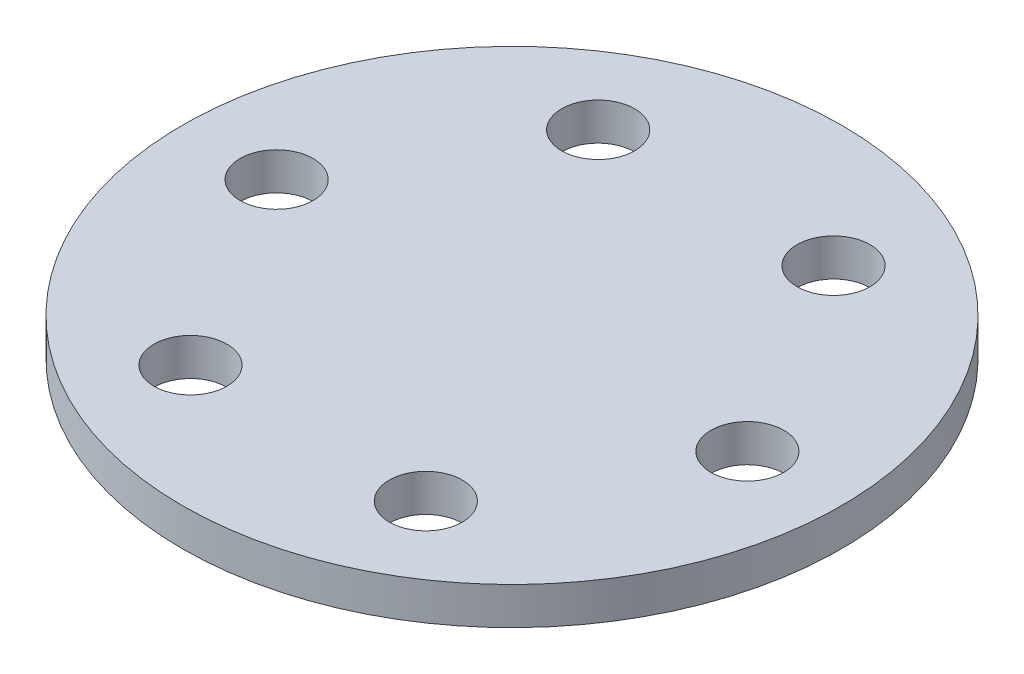
ISO-10303-21;
HEADER;
FILE_DESCRIPTION(('STEP AP214'),'2;1');
FILE_NAME('part.step','',(''),(''),'','','');
FILE_SCHEMA(('AUTOMOTIVE_DESIGN { 1 0 10303 214 1 1 1 1 }'));
ENDSEC;
DATA;
#1=APPLICATION_CONTEXT('core data for automotive mechanical design processes');
#2=APPLICATION_PROTOCOL_DEFINITION('international standard','automotive_design',2000,#1);
#3=PRODUCT_CONTEXT('',#1,'mechanical');
#4=PRODUCT('Part','Part','',(#3));
#5=PRODUCT_RELATED_PRODUCT_CATEGORY('part','',(#4));
#6=PRODUCT_DEFINITION_FORMATION('','',#4);
#7=PRODUCT_DEFINITION_CONTEXT('part definition',#1,'design');
#8=PRODUCT_DEFINITION('design','',#6,#7);
#9=PRODUCT_DEFINITION_SHAPE('','',#8);
#10=(LENGTH_UNIT() NAMED_UNIT(*) SI_UNIT(.MILLI.,.METRE.));
#11=(NAMED_UNIT(*) PLANE_ANGLE_UNIT() SI_UNIT($,.RADIAN.));
#12=(NAMED_UNIT(*) SI_UNIT($,.STERADIAN.) SOLID_ANGLE_UNIT());
#13=UNCERTAINTY_MEASURE_WITH_UNIT(LENGTH_MEASURE(1.E-05),#10,'distance_accuracy_value','');
#14=(GEOMETRIC_REPRESENTATION_CONTEXT(3) GLOBAL_UNCERTAINTY_ASSIGNED_CONTEXT((#13)) GLOBAL_UNIT_ASSIGNED_CONTEXT((#10,
#11,#12)) REPRESENTATION_CONTEXT('',''));
#15=CARTESIAN_POINT('',(0.,0.,0.));
#16=DIRECTION('',(0.,0.,1.));
#17=DIRECTION('',(1.,0.,0.));
#18=AXIS2_PLACEMENT_3D('',#15,#16,#17);
#19=CARTESIAN_POINT('',(0.,1.5875,0.));
#20=DIRECTION('',(0.,-1.,0.));
#21=DIRECTION('',(0.,0.,-1.));
#22=AXIS2_PLACEMENT_3D('',#19,#20,#21);
#23=CYLINDRICAL_SURFACE('',#22,14.);
#24=CARTESIAN_POINT('',(0.,1.5875,0.));
#25=DIRECTION('',(0.,1.,0.));
#26=DIRECTION('',(0.,0.,1.));
#27=AXIS2_PLACEMENT_3D('',#24,#25,#26);
#28=CIRCLE('',#27,14.);
#29=CARTESIAN_POINT('',(0.,1.5875,14.));
#30=VERTEX_POINT('',#29);
#31=EDGE_CURVE('E10',#30,#30,#28,.T.);
#32=ORIENTED_EDGE('',*,*,#31,.F.);
#33=EDGE_LOOP('',(#32));
#34=FACE_BOUND('',#33,.T.);
#35=CARTESIAN_POINT('',(0.,0.,0.));
#36=DIRECTION('',(0.,1.,0.));
#37=DIRECTION('',(0.,0.,1.));
#38=AXIS2_PLACEMENT_3D('',#35,#36,#37);
#39=CIRCLE('',#38,14.);
#40=CARTESIAN_POINT('',(0.,0.,14.));
#41=VERTEX_POINT('',#40);
#42=EDGE_CURVE('E39',#41,#41,#39,.T.);
#43=ORIENTED_EDGE('',*,*,#42,.T.);
#44=EDGE_LOOP('',(#43));
#45=FACE_BOUND('',#44,.T.);
#46=ADVANCED_FACE('F36',(#34,#45),#23,.T.);
#47=CARTESIAN_POINT('',(0.,1.5875,0.));
#48=DIRECTION('',(0.,1.,0.));
#49=DIRECTION('',(0.,0.,1.));
#50=AXIS2_PLACEMENT_3D('',#47,#48,#49);
#51=PLANE('',#50);
#52=CARTESIAN_POINT('',(-5.0000000000001,1.5875,8.66025403784433));
#53=DIRECTION('',(0.,1.,0.));
#54=DIRECTION('',(0.,0.,1.));
#55=AXIS2_PLACEMENT_3D('',#52,#53,#54);
#56=CIRCLE('',#55,1.54999999999999);
#57=CARTESIAN_POINT('',(-5.0000000000001,1.5875,10.2102540378443));
#58=VERTEX_POINT('',#57);
#59=EDGE_CURVE('E80',#58,#58,#56,.T.);
#60=ORIENTED_EDGE('',*,*,#59,.F.);
#61=EDGE_LOOP('',(#60));
#62=FACE_BOUND('',#61,.T.);
#63=CARTESIAN_POINT('',(-10.,1.5875,0.));
#64=DIRECTION('',(0.,1.,0.));
#65=DIRECTION('',(0.,0.,1.));
#66=AXIS2_PLACEMENT_3D('',#63,#64,#65);
#67=CIRCLE('',#66,1.54999999999999);
#68=CARTESIAN_POINT('',(-10.,1.5875,1.54999999999999));
#69=VERTEX_POINT('',#68);
#70=EDGE_CURVE('E74',#69,#69,#67,.T.);
#71=ORIENTED_EDGE('',*,*,#70,.F.);
#72=EDGE_LOOP('',(#71));
#73=FACE_BOUND('',#72,.T.);
#74=CARTESIAN_POINT('',(-4.99999999999998,1.5875,-8.6602540378444));
#75=DIRECTION('',(0.,1.,0.));
#76=DIRECTION('',(0.,0.,1.));
#77=AXIS2_PLACEMENT_3D('',#74,#75,#76);
#78=CIRCLE('',#77,1.54999999999999);
#79=CARTESIAN_POINT('',(-4.99999999999998,1.5875,-7.11025403784441));
#80=VERTEX_POINT('',#79);
#81=EDGE_CURVE('E68',#80,#80,#78,.T.);
#82=ORIENTED_EDGE('',*,*,#81,.F.);
#83=EDGE_LOOP('',(#82));
#84=FACE_BOUND('',#83,.T.);
#85=CARTESIAN_POINT('',(5.00000000000004,1.5875,-8.66025403784437));
#86=DIRECTION('',(0.,1.,0.));
#87=DIRECTION('',(0.,0.,1.));
#88=AXIS2_PLACEMENT_3D('',#85,#86,#87);
#89=CIRCLE('',#88,1.54999999999999);
#90=CARTESIAN_POINT('',(5.00000000000004,1.5875,-7.11025403784438));
#91=VERTEX_POINT('',#90);
#92=EDGE_CURVE('E62',#91,#91,#89,.T.);
#93=ORIENTED_EDGE('',*,*,#92,.F.);
#94=EDGE_LOOP('',(#93));
#95=FACE_BOUND('',#94,.T.);
#96=CARTESIAN_POINT('',(10.,1.5875,0.));
#97=DIRECTION('',(0.,1.,0.));
#98=DIRECTION('',(0.,0.,1.));
#99=AXIS2_PLACEMENT_3D('',#96,#97,#98);
#100=CIRCLE('',#99,1.54999999999999);
#101=CARTESIAN_POINT('',(10.,1.5875,1.55000000000006));
#102=VERTEX_POINT('',#101);
#103=EDGE_CURVE('E56',#102,#102,#100,.T.);
#104=ORIENTED_EDGE('',*,*,#103,.F.);
#105=EDGE_LOOP('',(#104));
#106=FACE_BOUND('',#105,.T.);
#107=CARTESIAN_POINT('',(4.99999999999992,1.5875,8.66025403784443));
#108=DIRECTION('',(0.,1.,0.));
#109=DIRECTION('',(0.,0.,1.));
#110=AXIS2_PLACEMENT_3D('',#107,#108,#109);
#111=CIRCLE('',#110,1.54999999999999);
#112=CARTESIAN_POINT('',(4.99999999999992,1.5875,10.2102540378444));
#113=VERTEX_POINT('',#112);
#114=EDGE_CURVE('E50',#113,#113,#111,.T.);
#115=ORIENTED_EDGE('',*,*,#114,.F.);
#116=EDGE_LOOP('',(#115));
#117=FACE_BOUND('',#116,.T.);
#118=ORIENTED_EDGE('',*,*,#31,.T.);
#119=EDGE_LOOP('',(#118));
#120=FACE_BOUND('',#119,.T.);
#121=ADVANCED_FACE('F86',(#62,#73,#84,#95,#106,#117,#120),#51,.T.);
#122=CARTESIAN_POINT('',(0.,0.,0.));
#123=DIRECTION('',(0.,1.,0.));
#124=DIRECTION('',(0.,0.,1.));
#125=AXIS2_PLACEMENT_3D('',#122,#123,#124);
#126=PLANE('',#125);
#127=CARTESIAN_POINT('',(-5.0000000000001,0.,8.66025403784433));
#128=DIRECTION('',(0.,1.,0.));
#129=DIRECTION('',(0.,0.,1.));
#130=AXIS2_PLACEMENT_3D('',#127,#128,#129);
#131=CIRCLE('',#130,1.55);
#132=CARTESIAN_POINT('',(-5.0000000000001,0.,10.2102540378443));
#133=VERTEX_POINT('',#132);
#134=EDGE_CURVE('E77',#133,#133,#131,.T.);
#135=ORIENTED_EDGE('',*,*,#134,.T.);
#136=EDGE_LOOP('',(#135));
#137=FACE_BOUND('',#136,.T.);
#138=CARTESIAN_POINT('',(-10.,0.,0.));
#139=DIRECTION('',(0.,1.,0.));
#140=DIRECTION('',(0.,0.,1.));
#141=AXIS2_PLACEMENT_3D('',#138,#139,#140);
#142=CIRCLE('',#141,1.55);
#143=CARTESIAN_POINT('',(-10.,0.,1.55));
#144=VERTEX_POINT('',#143);
#145=EDGE_CURVE('E71',#144,#144,#142,.T.);
#146=ORIENTED_EDGE('',*,*,#145,.T.);
#147=EDGE_LOOP('',(#146));
#148=FACE_BOUND('',#147,.T.);
#149=CARTESIAN_POINT('',(-4.99999999999998,0.,-8.6602540378444));
#150=DIRECTION('',(0.,1.,0.));
#151=DIRECTION('',(0.,0.,1.));
#152=AXIS2_PLACEMENT_3D('',#149,#150,#151);
#153=CIRCLE('',#152,1.55);
#154=CARTESIAN_POINT('',(-4.99999999999998,0.,-7.1102540378444));
#155=VERTEX_POINT('',#154);
#156=EDGE_CURVE('E65',#155,#155,#153,.T.);
#157=ORIENTED_EDGE('',*,*,#156,.T.);
#158=EDGE_LOOP('',(#157));
#159=FACE_BOUND('',#158,.T.);
#160=CARTESIAN_POINT('',(5.00000000000004,0.,-8.66025403784437));
#161=DIRECTION('',(0.,1.,0.));
#162=DIRECTION('',(0.,0.,1.));
#163=AXIS2_PLACEMENT_3D('',#160,#161,#162);
#164=CIRCLE('',#163,1.55);
#165=CARTESIAN_POINT('',(5.00000000000004,0.,-7.11025403784437));
#166=VERTEX_POINT('',#165);
#167=EDGE_CURVE('E59',#166,#166,#164,.T.);
#168=ORIENTED_EDGE('',*,*,#167,.T.);
#169=EDGE_LOOP('',(#168));
#170=FACE_BOUND('',#169,.T.);
#171=CARTESIAN_POINT('',(10.,0.,0.));
#172=DIRECTION('',(0.,1.,0.));
#173=DIRECTION('',(0.,0.,1.));
#174=AXIS2_PLACEMENT_3D('',#171,#172,#173);
#175=CIRCLE('',#174,1.55);
#176=CARTESIAN_POINT('',(10.,0.,1.55000000000007));
#177=VERTEX_POINT('',#176);
#178=EDGE_CURVE('E53',#177,#177,#175,.T.);
#179=ORIENTED_EDGE('',*,*,#178,.T.);
#180=EDGE_LOOP('',(#179));
#181=FACE_BOUND('',#180,.T.);
#182=CARTESIAN_POINT('',(4.99999999999992,0.,8.66025403784443));
#183=DIRECTION('',(0.,1.,0.));
#184=DIRECTION('',(0.,0.,1.));
#185=AXIS2_PLACEMENT_3D('',#182,#183,#184);
#186=CIRCLE('',#185,1.55);
#187=CARTESIAN_POINT('',(4.99999999999992,0.,10.2102540378444));
#188=VERTEX_POINT('',#187);
#189=EDGE_CURVE('E46',#188,#188,#186,.T.);
#190=ORIENTED_EDGE('',*,*,#189,.T.);
#191=EDGE_LOOP('',(#190));
#192=FACE_BOUND('',#191,.T.);
#193=ORIENTED_EDGE('',*,*,#42,.F.);
#194=EDGE_LOOP('',(#193));
#195=FACE_BOUND('',#194,.T.);
#196=ADVANCED_FACE('F89',(#137,#148,#159,#170,#181,#192,#195),#126,.F.);
#197=CARTESIAN_POINT('',(4.99999999999992,1.5875,8.66025403784443));
#198=DIRECTION('',(0.,1.,0.));
#199=DIRECTION('',(0.,0.,1.));
#200=AXIS2_PLACEMENT_3D('',#197,#198,#199);
#201=CYLINDRICAL_SURFACE('',#200,1.54999999999999);
#202=ORIENTED_EDGE('',*,*,#189,.F.);
#203=EDGE_LOOP('',(#202));
#204=FACE_BOUND('',#203,.T.);
#205=ORIENTED_EDGE('',*,*,#114,.T.);
#206=EDGE_LOOP('',(#205));
#207=FACE_BOUND('',#206,.T.);
#208=ADVANCED_FACE('F101',(#204,#207),#201,.F.);
#209=CARTESIAN_POINT('',(10.,1.5875,0.));
#210=DIRECTION('',(0.,1.,0.));
#211=DIRECTION('',(0.,0.,1.));
#212=AXIS2_PLACEMENT_3D('',#209,#210,#211);
#213=CYLINDRICAL_SURFACE('',#212,1.54999999999999);
#214=ORIENTED_EDGE('',*,*,#178,.F.);
#215=EDGE_LOOP('',(#214));
#216=FACE_BOUND('',#215,.T.);
#217=ORIENTED_EDGE('',*,*,#103,.T.);
#218=EDGE_LOOP('',(#217));
#219=FACE_BOUND('',#218,.T.);
#220=ADVANCED_FACE('F103',(#216,#219),#213,.F.);
#221=CARTESIAN_POINT('',(5.00000000000004,1.5875,-8.66025403784437));
#222=DIRECTION('',(0.,1.,0.));
#223=DIRECTION('',(0.,0.,1.));
#224=AXIS2_PLACEMENT_3D('',#221,#222,#223);
#225=CYLINDRICAL_SURFACE('',#224,1.54999999999999);
#226=ORIENTED_EDGE('',*,*,#167,.F.);
#227=EDGE_LOOP('',(#226));
#228=FACE_BOUND('',#227,.T.);
#229=ORIENTED_EDGE('',*,*,#92,.T.);
#230=EDGE_LOOP('',(#229));
#231=FACE_BOUND('',#230,.T.);
#232=ADVANCED_FACE('F110',(#228,#231),#225,.F.);
#233=CARTESIAN_POINT('',(-4.99999999999998,1.5875,-8.6602540378444));
#234=DIRECTION('',(0.,1.,0.));
#235=DIRECTION('',(0.,0.,1.));
#236=AXIS2_PLACEMENT_3D('',#233,#234,#235);
#237=CYLINDRICAL_SURFACE('',#236,1.54999999999999);
#238=ORIENTED_EDGE('',*,*,#156,.F.);
#239=EDGE_LOOP('',(#238));
#240=FACE_BOUND('',#239,.T.);
#241=ORIENTED_EDGE('',*,*,#81,.T.);
#242=EDGE_LOOP('',(#241));
#243=FACE_BOUND('',#242,.T.);
#244=ADVANCED_FACE('F153',(#240,#243),#237,.F.);
#245=CARTESIAN_POINT('',(-10.,1.5875,0.));
#246=DIRECTION('',(0.,1.,0.));
#247=DIRECTION('',(0.,0.,1.));
#248=AXIS2_PLACEMENT_3D('',#245,#246,#247);
#249=CYLINDRICAL_SURFACE('',#248,1.54999999999999);
#250=ORIENTED_EDGE('',*,*,#145,.F.);
#251=EDGE_LOOP('',(#250));
#252=FACE_BOUND('',#251,.T.);
#253=ORIENTED_EDGE('',*,*,#70,.T.);
#254=EDGE_LOOP('',(#253));
#255=FACE_BOUND('',#254,.T.);
#256=ADVANCED_FACE('F164',(#252,#255),#249,.F.);
#257=CARTESIAN_POINT('',(-5.0000000000001,1.5875,8.66025403784433));
#258=DIRECTION('',(0.,1.,0.));
#259=DIRECTION('',(0.,0.,1.));
#260=AXIS2_PLACEMENT_3D('',#257,#258,#259);
#261=CYLINDRICAL_SURFACE('',#260,1.54999999999999);
#262=ORIENTED_EDGE('',*,*,#134,.F.);
#263=EDGE_LOOP('',(#262));
#264=FACE_BOUND('',#263,.T.);
#265=ORIENTED_EDGE('',*,*,#59,.T.);
#266=EDGE_LOOP('',(#265));
#267=FACE_BOUND('',#266,.T.);
#268=ADVANCED_FACE('F84',(#264,#267),#261,.F.);
#269=CLOSED_SHELL('',(#46,#121,#196,#208,#220,#232,#244,#256,#268));
#270=MANIFOLD_SOLID_BREP('B2',#269);
#271=ADVANCED_BREP_SHAPE_REPRESENTATION('',(#18,#270),#14);
#272=SHAPE_DEFINITION_REPRESENTATION(#9,#271);
ENDSEC;
END-ISO-10303-21;
